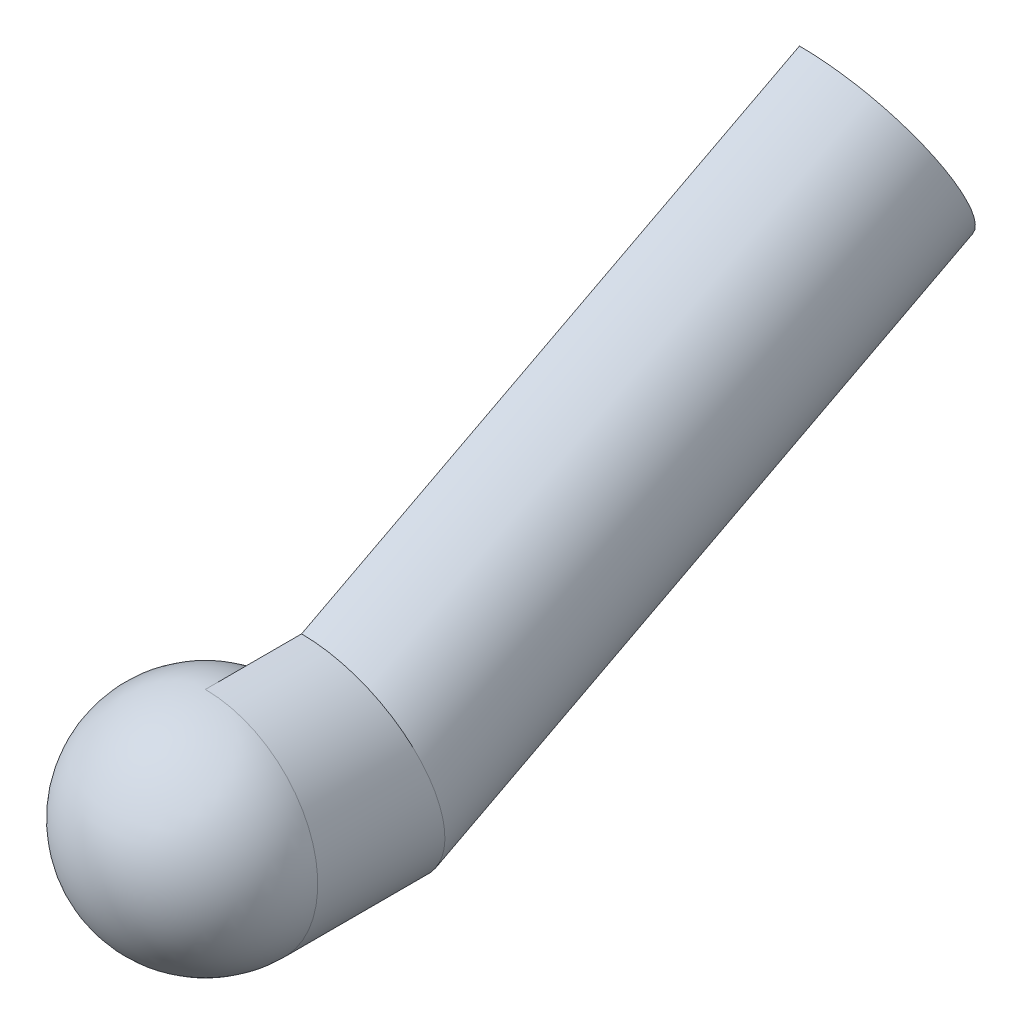
ISO-10303-21;
HEADER;
FILE_DESCRIPTION(('STEP AP214'),'2;1');
FILE_NAME('part.step','',(''),(''),'','','');
FILE_SCHEMA(('AUTOMOTIVE_DESIGN { 1 0 10303 214 1 1 1 1 }'));
ENDSEC;
DATA;
#1=APPLICATION_CONTEXT('core data for automotive mechanical design processes');
#2=APPLICATION_PROTOCOL_DEFINITION('international standard','automotive_design',2000,#1);
#3=PRODUCT_CONTEXT('',#1,'mechanical');
#4=PRODUCT('Part','Part','',(#3));
#5=PRODUCT_RELATED_PRODUCT_CATEGORY('part','',(#4));
#6=PRODUCT_DEFINITION_FORMATION('','',#4);
#7=PRODUCT_DEFINITION_CONTEXT('part definition',#1,'design');
#8=PRODUCT_DEFINITION('design','',#6,#7);
#9=PRODUCT_DEFINITION_SHAPE('','',#8);
#10=(LENGTH_UNIT() NAMED_UNIT(*) SI_UNIT(.MILLI.,.METRE.));
#11=(NAMED_UNIT(*) PLANE_ANGLE_UNIT() SI_UNIT($,.RADIAN.));
#12=(NAMED_UNIT(*) SI_UNIT($,.STERADIAN.) SOLID_ANGLE_UNIT());
#13=UNCERTAINTY_MEASURE_WITH_UNIT(LENGTH_MEASURE(1.E-05),#10,'distance_accuracy_value','');
#14=(GEOMETRIC_REPRESENTATION_CONTEXT(3) GLOBAL_UNCERTAINTY_ASSIGNED_CONTEXT((#13)) GLOBAL_UNIT_ASSIGNED_CONTEXT((#10,
#11,#12)) REPRESENTATION_CONTEXT('',''));
#15=CARTESIAN_POINT('',(0.,0.,0.));
#16=DIRECTION('',(0.,0.,1.));
#17=DIRECTION('',(1.,0.,0.));
#18=AXIS2_PLACEMENT_3D('',#15,#16,#17);
#19=CARTESIAN_POINT('',(0.,-5.,0.));
#20=DIRECTION('',(-1.,0.,0.));
#21=DIRECTION('',(0.,-1.,0.));
#22=AXIS2_PLACEMENT_3D('',#19,#20,#21);
#23=PLANE('',#22);
#24=CARTESIAN_POINT('',(0.,0.,0.));
#25=DIRECTION('',(-1.,0.,0.));
#26=DIRECTION('',(0.,0.,1.));
#27=AXIS2_PLACEMENT_3D('',#24,#25,#26);
#28=CIRCLE('',#27,5.);
#29=CARTESIAN_POINT('',(0.,5.,0.));
#30=VERTEX_POINT('',#29);
#31=CARTESIAN_POINT('',(0.,-5.,0.));
#32=VERTEX_POINT('',#31);
#33=EDGE_CURVE('E11',#30,#32,#28,.T.);
#34=ORIENTED_EDGE('',*,*,#33,.F.);
#35=DIRECTION('',(0.,0.,-1.));
#36=VECTOR('',#35,1.);
#37=CARTESIAN_POINT('',(0.,5.,0.));
#38=LINE('',#37,#36);
#39=CARTESIAN_POINT('',(0.,5.,-4.28014331217583));
#40=VERTEX_POINT('',#39);
#41=EDGE_CURVE('E48',#30,#40,#38,.T.);
#42=ORIENTED_EDGE('',*,*,#41,.T.);
#43=DIRECTION('',(0.,-0.971148853169838,-0.238474118065062));
#44=VECTOR('',#43,1.);
#45=CARTESIAN_POINT('',(0.,-3.44004601227625,-6.35267063137777));
#46=LINE('',#45,#44);
#47=CARTESIAN_POINT('',(0.,-5.,-6.73573101417105));
#48=VERTEX_POINT('',#47);
#49=EDGE_CURVE('E57',#40,#48,#46,.T.);
#50=ORIENTED_EDGE('',*,*,#49,.T.);
#51=DIRECTION('',(0.,0.,-1.));
#52=VECTOR('',#51,1.);
#53=CARTESIAN_POINT('',(0.,-5.,0.));
#54=LINE('',#53,#52);
#55=EDGE_CURVE('E76',#32,#48,#54,.T.);
#56=ORIENTED_EDGE('',*,*,#55,.F.);
#57=EDGE_LOOP('',(#34,#42,#50,#56));
#58=FACE_BOUND('',#57,.T.);
#59=ADVANCED_FACE('F33',(#58),#23,.T.);
#60=CARTESIAN_POINT('',(0.,12.1444686295149,-28.7450790804655));
#61=DIRECTION('',(0.,0.463187732539147,-0.886260190026182));
#62=DIRECTION('',(-1.,0.,0.));
#63=AXIS2_PLACEMENT_3D('',#60,#61,#62);
#64=PLANE('',#63);
#65=CARTESIAN_POINT('',(0.,12.1444686295149,-28.7450790804655));
#66=DIRECTION('',(0.,0.463187732539147,-0.886260190026182));
#67=DIRECTION('',(-1.,0.,0.));
#68=AXIS2_PLACEMENT_3D('',#65,#66,#67);
#69=CIRCLE('',#68,5.);
#70=CARTESIAN_POINT('',(0.,16.5757695796458,-26.4291404177698));
#71=VERTEX_POINT('',#70);
#72=CARTESIAN_POINT('',(0.,7.71316767938399,-31.0610177431613));
#73=VERTEX_POINT('',#72);
#74=EDGE_CURVE('E135',#71,#73,#69,.T.);
#75=ORIENTED_EDGE('',*,*,#74,.T.);
#76=DIRECTION('',(0.,0.886260190026182,0.463187732539147));
#77=VECTOR('',#76,1.);
#78=CARTESIAN_POINT('',(0.,7.71316767938399,-31.0610177431613));
#79=LINE('',#78,#77);
#80=EDGE_CURVE('E70',#73,#71,#79,.T.);
#81=ORIENTED_EDGE('',*,*,#80,.T.);
#82=EDGE_LOOP('',(#75,#81));
#83=FACE_BOUND('',#82,.T.);
#84=ADVANCED_FACE('F82',(#83),#64,.T.);
#85=CARTESIAN_POINT('',(0.,-0.671887728109915,-4.22235185130289));
#86=DIRECTION('',(0.,0.463187732539147,-0.886260190026182));
#87=DIRECTION('',(0.,0.886260190026182,0.463187732539147));
#88=AXIS2_PLACEMENT_3D('',#85,#86,#87);
#89=CYLINDRICAL_SURFACE('',#88,5.);
#90=CARTESIAN_POINT('',(0.,0.,-5.50793716317344));
#91=DIRECTION('',(0.,0.238474118065062,-0.971148853169838));
#92=DIRECTION('',(0.,-0.971148853169838,-0.238474118065062));
#93=AXIS2_PLACEMENT_3D('',#90,#91,#92);
#94=ELLIPSE('',#93,5.14854132163155,5.);
#95=EDGE_CURVE('E79',#48,#40,#94,.F.);
#96=ORIENTED_EDGE('',*,*,#95,.F.);
#97=DIRECTION('',(0.,0.463187732539147,-0.886260190026182));
#98=VECTOR('',#97,1.);
#99=CARTESIAN_POINT('',(0.,-5.10318867824082,-6.53829051399862));
#100=LINE('',#99,#98);
#101=EDGE_CURVE('E132',#48,#73,#100,.T.);
#102=ORIENTED_EDGE('',*,*,#101,.T.);
#103=ORIENTED_EDGE('',*,*,#74,.F.);
#104=DIRECTION('',(0.,0.463187732539147,-0.886260190026182));
#105=VECTOR('',#104,1.);
#106=CARTESIAN_POINT('',(0.,3.75941322202099,-1.90641318860715));
#107=LINE('',#106,#105);
#108=EDGE_CURVE('E133',#40,#71,#107,.T.);
#109=ORIENTED_EDGE('',*,*,#108,.F.);
#110=EDGE_LOOP('',(#96,#102,#103,#109));
#111=FACE_BOUND('',#110,.T.);
#112=ADVANCED_FACE('F89',(#111),#89,.T.);
#113=CARTESIAN_POINT('',(0.,-5.10318867824082,-6.53829051399862));
#114=DIRECTION('',(-1.,0.,0.));
#115=DIRECTION('',(0.,-1.,0.));
#116=AXIS2_PLACEMENT_3D('',#113,#114,#115);
#117=PLANE('',#116);
#118=ORIENTED_EDGE('',*,*,#49,.F.);
#119=ORIENTED_EDGE('',*,*,#108,.T.);
#120=ORIENTED_EDGE('',*,*,#80,.F.);
#121=ORIENTED_EDGE('',*,*,#101,.F.);
#122=EDGE_LOOP('',(#118,#119,#120,#121));
#123=FACE_BOUND('',#122,.T.);
#124=ADVANCED_FACE('F86',(#123),#117,.T.);
#125=CARTESIAN_POINT('',(0.,0.,0.));
#126=DIRECTION('',(0.,0.,-1.));
#127=DIRECTION('',(-1.,0.,0.));
#128=AXIS2_PLACEMENT_3D('',#125,#126,#127);
#129=CYLINDRICAL_SURFACE('',#128,5.);
#130=ORIENTED_EDGE('',*,*,#55,.T.);
#131=ORIENTED_EDGE('',*,*,#95,.T.);
#132=ORIENTED_EDGE('',*,*,#41,.F.);
#133=CARTESIAN_POINT('',(0.,0.,0.));
#134=DIRECTION('',(0.,0.,1.));
#135=DIRECTION('',(1.,0.,0.));
#136=AXIS2_PLACEMENT_3D('',#133,#134,#135);
#137=CIRCLE('',#136,5.);
#138=EDGE_CURVE('E41',#32,#30,#137,.T.);
#139=ORIENTED_EDGE('',*,*,#138,.F.);
#140=EDGE_LOOP('',(#130,#131,#132,#139));
#141=FACE_BOUND('',#140,.T.);
#142=ADVANCED_FACE('F75',(#141),#129,.T.);
#143=CARTESIAN_POINT('',(0.,0.,0.));
#144=DIRECTION('',(0.,1.,0.));
#145=DIRECTION('',(1.,0.,0.));
#146=AXIS2_PLACEMENT_3D('',#143,#144,#145);
#147=SPHERICAL_SURFACE('',#146,5.);
#148=ORIENTED_EDGE('',*,*,#138,.T.);
#149=ORIENTED_EDGE('',*,*,#33,.T.);
#150=EDGE_LOOP('',(#148,#149));
#151=FACE_BOUND('',#150,.T.);
#152=ADVANCED_FACE('F35',(#151),#147,.T.);
#153=CLOSED_SHELL('',(#59,#84,#112,#124,#142,#152));
#154=MANIFOLD_SOLID_BREP('B2',#153);
#155=ADVANCED_BREP_SHAPE_REPRESENTATION('',(#18,#154),#14);
#156=SHAPE_DEFINITION_REPRESENTATION(#9,#155);
ENDSEC;
END-ISO-10303-21;
